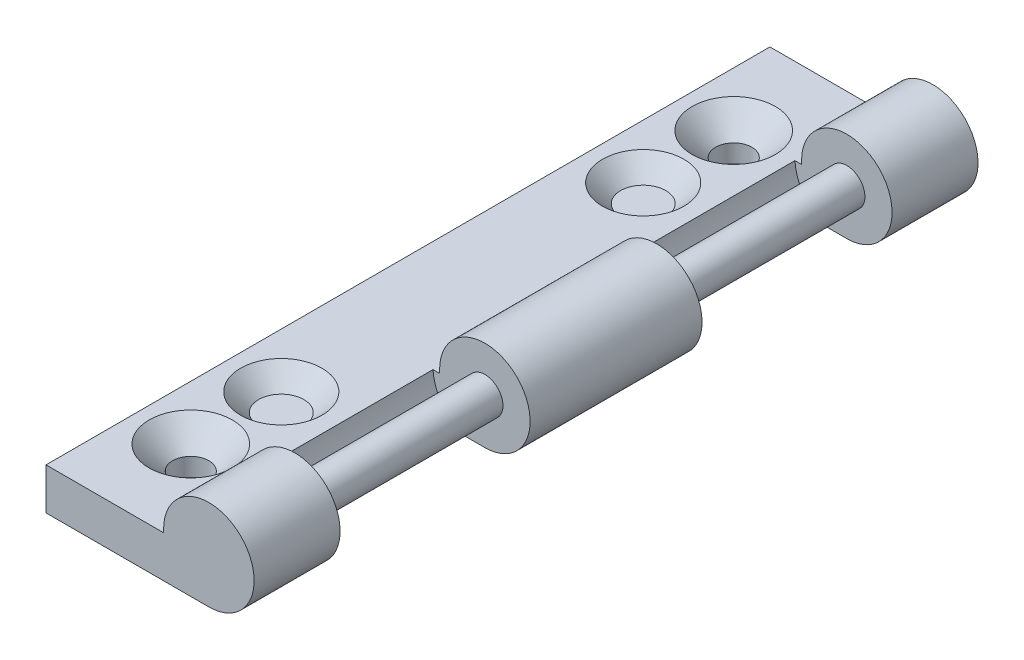
ISO-10303-21;
HEADER;
FILE_DESCRIPTION(('STEP AP214'),'2;1');
FILE_NAME('part.step','',(''),(''),'','','');
FILE_SCHEMA(('AUTOMOTIVE_DESIGN { 1 0 10303 214 1 1 1 1 }'));
ENDSEC;
DATA;
#1=APPLICATION_CONTEXT('core data for automotive mechanical design processes');
#2=APPLICATION_PROTOCOL_DEFINITION('international standard','automotive_design',2000,#1);
#3=PRODUCT_CONTEXT('',#1,'mechanical');
#4=PRODUCT('Part','Part','',(#3));
#5=PRODUCT_RELATED_PRODUCT_CATEGORY('part','',(#4));
#6=PRODUCT_DEFINITION_FORMATION('','',#4);
#7=PRODUCT_DEFINITION_CONTEXT('part definition',#1,'design');
#8=PRODUCT_DEFINITION('design','',#6,#7);
#9=PRODUCT_DEFINITION_SHAPE('','',#8);
#10=(LENGTH_UNIT() NAMED_UNIT(*) SI_UNIT(.MILLI.,.METRE.));
#11=(NAMED_UNIT(*) PLANE_ANGLE_UNIT() SI_UNIT($,.RADIAN.));
#12=(NAMED_UNIT(*) SI_UNIT($,.STERADIAN.) SOLID_ANGLE_UNIT());
#13=UNCERTAINTY_MEASURE_WITH_UNIT(LENGTH_MEASURE(1.E-05),#10,'distance_accuracy_value','');
#14=(GEOMETRIC_REPRESENTATION_CONTEXT(3) GLOBAL_UNCERTAINTY_ASSIGNED_CONTEXT((#13)) GLOBAL_UNIT_ASSIGNED_CONTEXT((#10,
#11,#12)) REPRESENTATION_CONTEXT('',''));
#15=CARTESIAN_POINT('',(0.,0.,0.));
#16=DIRECTION('',(0.,0.,1.));
#17=DIRECTION('',(1.,0.,0.));
#18=AXIS2_PLACEMENT_3D('',#15,#16,#17);
#19=CARTESIAN_POINT('',(0.,0.,0.));
#20=DIRECTION('',(0.,1.,0.));
#21=DIRECTION('',(0.,0.,1.));
#22=AXIS2_PLACEMENT_3D('',#19,#20,#21);
#23=PLANE('',#22);
#24=CARTESIAN_POINT('',(-6.,0.,-35.));
#25=DIRECTION('',(0.,-1.,0.));
#26=DIRECTION('',(0.,0.,-1.));
#27=AXIS2_PLACEMENT_3D('',#24,#25,#26);
#28=CIRCLE('',#27,1.);
#29=CARTESIAN_POINT('',(-6.,0.,-36.));
#30=VERTEX_POINT('',#29);
#31=EDGE_CURVE('E256',#30,#30,#28,.T.);
#32=ORIENTED_EDGE('',*,*,#31,.F.);
#33=EDGE_LOOP('',(#32));
#34=FACE_BOUND('',#33,.T.);
#35=CARTESIAN_POINT('',(-6.,0.,-5.));
#36=DIRECTION('',(0.,1.,0.));
#37=DIRECTION('',(0.,0.,1.));
#38=AXIS2_PLACEMENT_3D('',#35,#36,#37);
#39=CIRCLE('',#38,1.);
#40=CARTESIAN_POINT('',(-6.,0.,-4.));
#41=VERTEX_POINT('',#40);
#42=EDGE_CURVE('E259',#41,#41,#39,.T.);
#43=ORIENTED_EDGE('',*,*,#42,.T.);
#44=EDGE_LOOP('',(#43));
#45=FACE_BOUND('',#44,.T.);
#46=DIRECTION('',(-1.,0.,0.));
#47=VECTOR('',#46,1.);
#48=CARTESIAN_POINT('',(0.,0.,-24.75));
#49=LINE('',#48,#47);
#50=CARTESIAN_POINT('',(0.,0.,-24.75));
#51=VERTEX_POINT('',#50);
#52=CARTESIAN_POINT('',(-1.41972708645007,0.,-24.75));
#53=VERTEX_POINT('',#52);
#54=EDGE_CURVE('E273',#51,#53,#49,.T.);
#55=ORIENTED_EDGE('',*,*,#54,.F.);
#56=DIRECTION('',(0.,0.,-1.));
#57=VECTOR('',#56,1.);
#58=CARTESIAN_POINT('',(0.,0.,-40.));
#59=LINE('',#58,#57);
#60=CARTESIAN_POINT('',(0.,0.,-15.25));
#61=VERTEX_POINT('',#60);
#62=EDGE_CURVE('E300',#61,#51,#59,.T.);
#63=ORIENTED_EDGE('',*,*,#62,.F.);
#64=DIRECTION('',(1.,0.,0.));
#65=VECTOR('',#64,1.);
#66=CARTESIAN_POINT('',(0.,0.,-15.25));
#67=LINE('',#66,#65);
#68=CARTESIAN_POINT('',(-1.41972708645007,0.,-15.25));
#69=VERTEX_POINT('',#68);
#70=EDGE_CURVE('E283',#69,#61,#67,.T.);
#71=ORIENTED_EDGE('',*,*,#70,.F.);
#72=DIRECTION('',(0.,0.,1.));
#73=VECTOR('',#72,1.);
#74=CARTESIAN_POINT('',(-1.41972708645007,0.,-15.25));
#75=LINE('',#74,#73);
#76=CARTESIAN_POINT('',(-1.41972708645007,0.,-4.75));
#77=VERTEX_POINT('',#76);
#78=EDGE_CURVE('E183',#69,#77,#75,.T.);
#79=ORIENTED_EDGE('',*,*,#78,.T.);
#80=DIRECTION('',(1.,0.,0.));
#81=VECTOR('',#80,1.);
#82=CARTESIAN_POINT('',(0.,0.,-4.75));
#83=LINE('',#82,#81);
#84=CARTESIAN_POINT('',(0.,0.,-4.75));
#85=VERTEX_POINT('',#84);
#86=EDGE_CURVE('E279',#77,#85,#83,.T.);
#87=ORIENTED_EDGE('',*,*,#86,.T.);
#88=CARTESIAN_POINT('',(0.,0.,0.));
#89=VERTEX_POINT('',#88);
#90=EDGE_CURVE('E175',#89,#85,#59,.T.);
#91=ORIENTED_EDGE('',*,*,#90,.F.);
#92=DIRECTION('',(1.,0.,0.));
#93=VECTOR('',#92,1.);
#94=CARTESIAN_POINT('',(-9.00000000000002,0.,0.));
#95=LINE('',#94,#93);
#96=CARTESIAN_POINT('',(-9.00000000000002,0.,0.));
#97=VERTEX_POINT('',#96);
#98=EDGE_CURVE('E297',#97,#89,#95,.T.);
#99=ORIENTED_EDGE('',*,*,#98,.F.);
#100=DIRECTION('',(0.,0.,1.));
#101=VECTOR('',#100,1.);
#102=CARTESIAN_POINT('',(-9.,0.,-40.));
#103=LINE('',#102,#101);
#104=CARTESIAN_POINT('',(-9.,0.,-40.));
#105=VERTEX_POINT('',#104);
#106=EDGE_CURVE('E294',#105,#97,#103,.T.);
#107=ORIENTED_EDGE('',*,*,#106,.F.);
#108=DIRECTION('',(-1.,0.,0.));
#109=VECTOR('',#108,1.);
#110=CARTESIAN_POINT('',(-9.,0.,-40.));
#111=LINE('',#110,#109);
#112=CARTESIAN_POINT('',(0.,0.,-40.));
#113=VERTEX_POINT('',#112);
#114=EDGE_CURVE('E170',#113,#105,#111,.T.);
#115=ORIENTED_EDGE('',*,*,#114,.F.);
#116=CARTESIAN_POINT('',(0.,0.,-35.25));
#117=VERTEX_POINT('',#116);
#118=EDGE_CURVE('E298',#117,#113,#59,.T.);
#119=ORIENTED_EDGE('',*,*,#118,.F.);
#120=DIRECTION('',(-1.,0.,0.));
#121=VECTOR('',#120,1.);
#122=CARTESIAN_POINT('',(0.,0.,-35.25));
#123=LINE('',#122,#121);
#124=CARTESIAN_POINT('',(-1.41972708645007,0.,-35.25));
#125=VERTEX_POINT('',#124);
#126=EDGE_CURVE('E59',#117,#125,#123,.T.);
#127=ORIENTED_EDGE('',*,*,#126,.T.);
#128=DIRECTION('',(0.,0.,-1.));
#129=VECTOR('',#128,1.);
#130=CARTESIAN_POINT('',(-1.41972708645007,0.,-24.75));
#131=LINE('',#130,#129);
#132=EDGE_CURVE('E191',#53,#125,#131,.T.);
#133=ORIENTED_EDGE('',*,*,#132,.F.);
#134=EDGE_LOOP('',(#55,#63,#71,#79,#87,#91,#99,#107,#115,#119,#127,#133));
#135=FACE_BOUND('',#134,.T.);
#136=ADVANCED_FACE('F35',(#34,#45,#135),#23,.F.);
#137=CARTESIAN_POINT('',(0.,2.5,-47.0710678118655));
#138=DIRECTION('',(0.,0.,1.));
#139=DIRECTION('',(1.,0.,0.));
#140=AXIS2_PLACEMENT_3D('',#137,#138,#139);
#141=CYLINDRICAL_SURFACE('',#140,2.5);
#142=ORIENTED_EDGE('',*,*,#62,.T.);
#143=CARTESIAN_POINT('',(0.,2.5,-24.75));
#144=DIRECTION('',(0.,0.,-1.));
#145=DIRECTION('',(-1.,0.,0.));
#146=AXIS2_PLACEMENT_3D('',#143,#144,#145);
#147=CIRCLE('',#146,2.5);
#148=CARTESIAN_POINT('',(-2.5,2.5,-24.75));
#149=VERTEX_POINT('',#148);
#150=EDGE_CURVE('E188',#51,#149,#147,.F.);
#151=ORIENTED_EDGE('',*,*,#150,.T.);
#152=DIRECTION('',(0.,0.,1.));
#153=VECTOR('',#152,1.);
#154=CARTESIAN_POINT('',(-2.5,2.5,-47.0710678118655));
#155=LINE('',#154,#153);
#156=CARTESIAN_POINT('',(-2.5,2.5,-15.25));
#157=VERTEX_POINT('',#156);
#158=EDGE_CURVE('E295',#149,#157,#155,.T.);
#159=ORIENTED_EDGE('',*,*,#158,.T.);
#160=CARTESIAN_POINT('',(0.,2.5,-15.25));
#161=DIRECTION('',(0.,0.,1.));
#162=DIRECTION('',(1.,0.,0.));
#163=AXIS2_PLACEMENT_3D('',#160,#161,#162);
#164=CIRCLE('',#163,2.5);
#165=EDGE_CURVE('E180',#157,#61,#164,.F.);
#166=ORIENTED_EDGE('',*,*,#165,.T.);
#167=EDGE_LOOP('',(#142,#151,#159,#166));
#168=FACE_BOUND('',#167,.T.);
#169=ADVANCED_FACE('F334',(#168),#141,.T.);
#170=CARTESIAN_POINT('',(0.,2.5,-35.25));
#171=DIRECTION('',(0.,0.,-1.));
#172=DIRECTION('',(-1.,0.,0.));
#173=AXIS2_PLACEMENT_3D('',#170,#171,#172);
#174=CIRCLE('',#173,2.5);
#175=CARTESIAN_POINT('',(-2.5,2.5,-35.25));
#176=VERTEX_POINT('',#175);
#177=EDGE_CURVE('E186',#117,#176,#174,.F.);
#178=ORIENTED_EDGE('',*,*,#177,.F.);
#179=ORIENTED_EDGE('',*,*,#118,.T.);
#180=CARTESIAN_POINT('',(0.,2.5,-40.));
#181=DIRECTION('',(0.,0.,1.));
#182=DIRECTION('',(1.,0.,0.));
#183=AXIS2_PLACEMENT_3D('',#180,#181,#182);
#184=CIRCLE('',#183,2.5);
#185=CARTESIAN_POINT('',(-2.5,2.5,-40.));
#186=VERTEX_POINT('',#185);
#187=EDGE_CURVE('E288',#186,#113,#184,.F.);
#188=ORIENTED_EDGE('',*,*,#187,.F.);
#189=EDGE_CURVE('E291',#186,#176,#155,.T.);
#190=ORIENTED_EDGE('',*,*,#189,.T.);
#191=EDGE_LOOP('',(#178,#179,#188,#190));
#192=FACE_BOUND('',#191,.T.);
#193=ADVANCED_FACE('F309',(#192),#141,.T.);
#194=CARTESIAN_POINT('',(-9.,2.5,-40.));
#195=DIRECTION('',(1.,0.,0.));
#196=DIRECTION('',(0.,0.,-1.));
#197=AXIS2_PLACEMENT_3D('',#194,#195,#196);
#198=PLANE('',#197);
#199=DIRECTION('',(0.,-1.,0.));
#200=VECTOR('',#199,1.);
#201=CARTESIAN_POINT('',(-9.00000000000002,2.5,0.));
#202=LINE('',#201,#200);
#203=CARTESIAN_POINT('',(-9.00000000000002,2.3,0.));
#204=VERTEX_POINT('',#203);
#205=EDGE_CURVE('E164',#204,#97,#202,.T.);
#206=ORIENTED_EDGE('',*,*,#205,.F.);
#207=DIRECTION('',(0.,0.,1.));
#208=VECTOR('',#207,1.);
#209=CARTESIAN_POINT('',(-9.00000000000002,2.3,-40.));
#210=LINE('',#209,#208);
#211=CARTESIAN_POINT('',(-9.00000000000002,2.3,-40.));
#212=VERTEX_POINT('',#211);
#213=EDGE_CURVE('E147',#212,#204,#210,.T.);
#214=ORIENTED_EDGE('',*,*,#213,.F.);
#215=DIRECTION('',(0.,-1.,0.));
#216=VECTOR('',#215,1.);
#217=CARTESIAN_POINT('',(-9.,2.5,-40.));
#218=LINE('',#217,#216);
#219=EDGE_CURVE('E162',#212,#105,#218,.T.);
#220=ORIENTED_EDGE('',*,*,#219,.T.);
#221=ORIENTED_EDGE('',*,*,#106,.T.);
#222=EDGE_LOOP('',(#206,#214,#220,#221));
#223=FACE_BOUND('',#222,.T.);
#224=ADVANCED_FACE('F160',(#223),#198,.F.);
#225=CARTESIAN_POINT('',(-9.00000000000002,2.5,0.));
#226=DIRECTION('',(0.,0.,-1.));
#227=DIRECTION('',(-1.,0.,0.));
#228=AXIS2_PLACEMENT_3D('',#225,#226,#227);
#229=PLANE('',#228);
#230=CARTESIAN_POINT('',(0.,2.5,0.));
#231=DIRECTION('',(0.,0.,1.));
#232=DIRECTION('',(1.,0.,0.));
#233=AXIS2_PLACEMENT_3D('',#230,#231,#232);
#234=CIRCLE('',#233,2.5);
#235=CARTESIAN_POINT('',(-2.5,2.5,0.));
#236=VERTEX_POINT('',#235);
#237=EDGE_CURVE('E285',#89,#236,#234,.T.);
#238=ORIENTED_EDGE('',*,*,#237,.T.);
#239=DIRECTION('',(0.,1.,0.));
#240=VECTOR('',#239,1.);
#241=CARTESIAN_POINT('',(-2.5,2.5,0.));
#242=LINE('',#241,#240);
#243=CARTESIAN_POINT('',(-2.5,2.3,0.));
#244=VERTEX_POINT('',#243);
#245=EDGE_CURVE('E156',#244,#236,#242,.T.);
#246=ORIENTED_EDGE('',*,*,#245,.F.);
#247=DIRECTION('',(1.,0.,0.));
#248=VECTOR('',#247,1.);
#249=CARTESIAN_POINT('',(-9.00000000000002,2.3,0.));
#250=LINE('',#249,#248);
#251=EDGE_CURVE('E223',#204,#244,#250,.T.);
#252=ORIENTED_EDGE('',*,*,#251,.F.);
#253=ORIENTED_EDGE('',*,*,#205,.T.);
#254=ORIENTED_EDGE('',*,*,#98,.T.);
#255=EDGE_LOOP('',(#238,#246,#252,#253,#254));
#256=FACE_BOUND('',#255,.T.);
#257=ADVANCED_FACE('F349',(#256),#229,.F.);
#258=CARTESIAN_POINT('',(-9.,2.5,-40.));
#259=DIRECTION('',(0.,0.,1.));
#260=DIRECTION('',(1.,0.,0.));
#261=AXIS2_PLACEMENT_3D('',#258,#259,#260);
#262=PLANE('',#261);
#263=DIRECTION('',(1.,0.,0.));
#264=VECTOR('',#263,1.);
#265=CARTESIAN_POINT('',(-9.00000000000002,2.3,-40.));
#266=LINE('',#265,#264);
#267=CARTESIAN_POINT('',(-2.5,2.3,-40.));
#268=VERTEX_POINT('',#267);
#269=EDGE_CURVE('E142',#212,#268,#266,.T.);
#270=ORIENTED_EDGE('',*,*,#269,.T.);
#271=DIRECTION('',(0.,1.,0.));
#272=VECTOR('',#271,1.);
#273=CARTESIAN_POINT('',(-2.5,2.5,-40.));
#274=LINE('',#273,#272);
#275=EDGE_CURVE('E155',#268,#186,#274,.T.);
#276=ORIENTED_EDGE('',*,*,#275,.T.);
#277=ORIENTED_EDGE('',*,*,#187,.T.);
#278=ORIENTED_EDGE('',*,*,#114,.T.);
#279=ORIENTED_EDGE('',*,*,#219,.F.);
#280=EDGE_LOOP('',(#270,#276,#277,#278,#279));
#281=FACE_BOUND('',#280,.T.);
#282=ADVANCED_FACE('F167',(#281),#262,.F.);
#283=CARTESIAN_POINT('',(0.,2.5,-4.75));
#284=DIRECTION('',(0.,0.,1.));
#285=DIRECTION('',(1.,0.,0.));
#286=AXIS2_PLACEMENT_3D('',#283,#284,#285);
#287=CIRCLE('',#286,2.5);
#288=CARTESIAN_POINT('',(-2.5,2.5,-4.75));
#289=VERTEX_POINT('',#288);
#290=EDGE_CURVE('E173',#289,#85,#287,.F.);
#291=ORIENTED_EDGE('',*,*,#290,.F.);
#292=EDGE_CURVE('E290',#289,#236,#155,.T.);
#293=ORIENTED_EDGE('',*,*,#292,.T.);
#294=ORIENTED_EDGE('',*,*,#237,.F.);
#295=ORIENTED_EDGE('',*,*,#90,.T.);
#296=EDGE_LOOP('',(#291,#293,#294,#295));
#297=FACE_BOUND('',#296,.T.);
#298=ADVANCED_FACE('F342',(#297),#141,.T.);
#299=CARTESIAN_POINT('',(0.,2.5,-15.25));
#300=DIRECTION('',(0.,0.,1.));
#301=DIRECTION('',(1.,0.,0.));
#302=AXIS2_PLACEMENT_3D('',#299,#300,#301);
#303=CYLINDRICAL_SURFACE('',#302,2.875);
#304=CARTESIAN_POINT('',(0.,2.5,-15.25));
#305=DIRECTION('',(0.,0.,1.));
#306=DIRECTION('',(1.,0.,0.));
#307=AXIS2_PLACEMENT_3D('',#304,#305,#306);
#308=CIRCLE('',#307,2.875);
#309=CARTESIAN_POINT('',(-2.86803504162693,2.3,-15.25));
#310=VERTEX_POINT('',#309);
#311=EDGE_CURVE('E277',#310,#69,#308,.T.);
#312=ORIENTED_EDGE('',*,*,#311,.F.);
#313=DIRECTION('',(0.,0.,1.));
#314=VECTOR('',#313,1.);
#315=CARTESIAN_POINT('',(-2.86803504162693,2.3,-15.25));
#316=LINE('',#315,#314);
#317=CARTESIAN_POINT('',(-2.86803504162693,2.3,-4.75));
#318=VERTEX_POINT('',#317);
#319=EDGE_CURVE('E244',#310,#318,#316,.T.);
#320=ORIENTED_EDGE('',*,*,#319,.T.);
#321=CARTESIAN_POINT('',(0.,2.5,-4.75));
#322=DIRECTION('',(0.,0.,1.));
#323=DIRECTION('',(1.,0.,0.));
#324=AXIS2_PLACEMENT_3D('',#321,#322,#323);
#325=CIRCLE('',#324,2.875);
#326=EDGE_CURVE('E276',#318,#77,#325,.T.);
#327=ORIENTED_EDGE('',*,*,#326,.T.);
#328=ORIENTED_EDGE('',*,*,#78,.F.);
#329=EDGE_LOOP('',(#312,#320,#327,#328));
#330=FACE_BOUND('',#329,.T.);
#331=ADVANCED_FACE('F534',(#330),#303,.F.);
#332=CARTESIAN_POINT('',(0.,2.5,-15.25));
#333=DIRECTION('',(0.,0.,1.));
#334=DIRECTION('',(1.,0.,0.));
#335=AXIS2_PLACEMENT_3D('',#332,#333,#334);
#336=PLANE('',#335);
#337=DIRECTION('',(0.,1.,0.));
#338=VECTOR('',#337,1.);
#339=CARTESIAN_POINT('',(-2.5,2.5,-15.25));
#340=LINE('',#339,#338);
#341=CARTESIAN_POINT('',(-2.5,2.3,-15.25));
#342=VERTEX_POINT('',#341);
#343=EDGE_CURVE('E254',#342,#157,#340,.T.);
#344=ORIENTED_EDGE('',*,*,#343,.F.);
#345=DIRECTION('',(1.,0.,0.));
#346=VECTOR('',#345,1.);
#347=CARTESIAN_POINT('',(0.,2.3,-15.25));
#348=LINE('',#347,#346);
#349=EDGE_CURVE('E247',#310,#342,#348,.T.);
#350=ORIENTED_EDGE('',*,*,#349,.F.);
#351=ORIENTED_EDGE('',*,*,#311,.T.);
#352=ORIENTED_EDGE('',*,*,#70,.T.);
#353=ORIENTED_EDGE('',*,*,#165,.F.);
#354=EDGE_LOOP('',(#344,#350,#351,#352,#353));
#355=FACE_BOUND('',#354,.T.);
#356=CARTESIAN_POINT('',(0.,2.5,-15.25));
#357=DIRECTION('',(0.,0.,1.));
#358=DIRECTION('',(1.,0.,0.));
#359=AXIS2_PLACEMENT_3D('',#356,#357,#358);
#360=CIRCLE('',#359,1.);
#361=CARTESIAN_POINT('',(1.,2.5,-15.25));
#362=VERTEX_POINT('',#361);
#363=EDGE_CURVE('E265',#362,#362,#360,.T.);
#364=ORIENTED_EDGE('',*,*,#363,.F.);
#365=EDGE_LOOP('',(#364));
#366=FACE_BOUND('',#365,.T.);
#367=ADVANCED_FACE('F525',(#355,#366),#336,.T.);
#368=CARTESIAN_POINT('',(0.,2.5,-4.75));
#369=DIRECTION('',(0.,0.,1.));
#370=DIRECTION('',(1.,0.,0.));
#371=AXIS2_PLACEMENT_3D('',#368,#369,#370);
#372=PLANE('',#371);
#373=CARTESIAN_POINT('',(0.,2.5,-4.75));
#374=DIRECTION('',(0.,0.,1.));
#375=DIRECTION('',(1.,0.,0.));
#376=AXIS2_PLACEMENT_3D('',#373,#374,#375);
#377=CIRCLE('',#376,1.);
#378=CARTESIAN_POINT('',(1.,2.5,-4.75));
#379=VERTEX_POINT('',#378);
#380=EDGE_CURVE('E194',#379,#379,#377,.F.);
#381=ORIENTED_EDGE('',*,*,#380,.F.);
#382=EDGE_LOOP('',(#381));
#383=FACE_BOUND('',#382,.T.);
#384=DIRECTION('',(1.,0.,0.));
#385=VECTOR('',#384,1.);
#386=CARTESIAN_POINT('',(0.,2.3,-4.75));
#387=LINE('',#386,#385);
#388=CARTESIAN_POINT('',(-2.5,2.3,-4.75));
#389=VERTEX_POINT('',#388);
#390=EDGE_CURVE('E241',#318,#389,#387,.T.);
#391=ORIENTED_EDGE('',*,*,#390,.T.);
#392=DIRECTION('',(0.,1.,0.));
#393=VECTOR('',#392,1.);
#394=CARTESIAN_POINT('',(-2.5,2.5,-4.75));
#395=LINE('',#394,#393);
#396=EDGE_CURVE('E251',#389,#289,#395,.T.);
#397=ORIENTED_EDGE('',*,*,#396,.T.);
#398=ORIENTED_EDGE('',*,*,#290,.T.);
#399=ORIENTED_EDGE('',*,*,#86,.F.);
#400=ORIENTED_EDGE('',*,*,#326,.F.);
#401=EDGE_LOOP('',(#391,#397,#398,#399,#400));
#402=FACE_BOUND('',#401,.T.);
#403=ADVANCED_FACE('F508',(#383,#402),#372,.F.);
#404=CARTESIAN_POINT('',(0.,2.5,-24.75));
#405=DIRECTION('',(0.,0.,-1.));
#406=DIRECTION('',(-1.,0.,0.));
#407=AXIS2_PLACEMENT_3D('',#404,#405,#406);
#408=CYLINDRICAL_SURFACE('',#407,2.875);
#409=DIRECTION('',(0.,0.,-1.));
#410=VECTOR('',#409,1.);
#411=CARTESIAN_POINT('',(-2.86803504162693,2.3,-24.75));
#412=LINE('',#411,#410);
#413=CARTESIAN_POINT('',(-2.86803504162693,2.3,-24.75));
#414=VERTEX_POINT('',#413);
#415=CARTESIAN_POINT('',(-2.86803504162693,2.3,-35.25));
#416=VERTEX_POINT('',#415);
#417=EDGE_CURVE('E51',#414,#416,#412,.T.);
#418=ORIENTED_EDGE('',*,*,#417,.F.);
#419=CARTESIAN_POINT('',(0.,2.5,-24.75));
#420=DIRECTION('',(0.,0.,1.));
#421=DIRECTION('',(1.,0.,0.));
#422=AXIS2_PLACEMENT_3D('',#419,#420,#421);
#423=CIRCLE('',#422,2.875);
#424=EDGE_CURVE('E269',#414,#53,#423,.T.);
#425=ORIENTED_EDGE('',*,*,#424,.T.);
#426=ORIENTED_EDGE('',*,*,#132,.T.);
#427=CARTESIAN_POINT('',(0.,2.5,-35.25));
#428=DIRECTION('',(0.,0.,1.));
#429=DIRECTION('',(1.,0.,0.));
#430=AXIS2_PLACEMENT_3D('',#427,#428,#429);
#431=CIRCLE('',#430,2.875);
#432=EDGE_CURVE('E268',#416,#125,#431,.T.);
#433=ORIENTED_EDGE('',*,*,#432,.F.);
#434=EDGE_LOOP('',(#418,#425,#426,#433));
#435=FACE_BOUND('',#434,.T.);
#436=ADVANCED_FACE('F328',(#435),#408,.F.);
#437=CARTESIAN_POINT('',(0.,2.5,-24.75));
#438=DIRECTION('',(0.,0.,-1.));
#439=DIRECTION('',(1.,0.,0.));
#440=AXIS2_PLACEMENT_3D('',#437,#438,#439);
#441=PLANE('',#440);
#442=DIRECTION('',(0.,-1.,0.));
#443=VECTOR('',#442,1.);
#444=CARTESIAN_POINT('',(-2.5,2.5,-24.75));
#445=LINE('',#444,#443);
#446=CARTESIAN_POINT('',(-2.5,2.3,-24.75));
#447=VERTEX_POINT('',#446);
#448=EDGE_CURVE('E249',#149,#447,#445,.T.);
#449=ORIENTED_EDGE('',*,*,#448,.F.);
#450=ORIENTED_EDGE('',*,*,#150,.F.);
#451=ORIENTED_EDGE('',*,*,#54,.T.);
#452=ORIENTED_EDGE('',*,*,#424,.F.);
#453=DIRECTION('',(-1.,0.,0.));
#454=VECTOR('',#453,1.);
#455=CARTESIAN_POINT('',(0.,2.3,-24.75));
#456=LINE('',#455,#454);
#457=EDGE_CURVE('E239',#447,#414,#456,.T.);
#458=ORIENTED_EDGE('',*,*,#457,.F.);
#459=EDGE_LOOP('',(#449,#450,#451,#452,#458));
#460=FACE_BOUND('',#459,.T.);
#461=CARTESIAN_POINT('',(0.,2.5,-24.75));
#462=DIRECTION('',(0.,0.,-1.));
#463=DIRECTION('',(-1.,0.,0.));
#464=AXIS2_PLACEMENT_3D('',#461,#462,#463);
#465=CIRCLE('',#464,1.);
#466=CARTESIAN_POINT('',(1.,2.5,-24.75));
#467=VERTEX_POINT('',#466);
#468=EDGE_CURVE('E197',#467,#467,#465,.T.);
#469=ORIENTED_EDGE('',*,*,#468,.F.);
#470=EDGE_LOOP('',(#469));
#471=FACE_BOUND('',#470,.T.);
#472=ADVANCED_FACE('F318',(#460,#471),#441,.T.);
#473=CARTESIAN_POINT('',(0.,2.5,-35.25));
#474=DIRECTION('',(0.,0.,-1.));
#475=DIRECTION('',(1.,0.,0.));
#476=AXIS2_PLACEMENT_3D('',#473,#474,#475);
#477=PLANE('',#476);
#478=CARTESIAN_POINT('',(0.,2.5,-35.25));
#479=DIRECTION('',(0.,0.,-1.));
#480=DIRECTION('',(-1.,0.,0.));
#481=AXIS2_PLACEMENT_3D('',#478,#479,#480);
#482=CIRCLE('',#481,1.);
#483=CARTESIAN_POINT('',(1.,2.5,-35.25));
#484=VERTEX_POINT('',#483);
#485=EDGE_CURVE('E262',#484,#484,#482,.F.);
#486=ORIENTED_EDGE('',*,*,#485,.F.);
#487=EDGE_LOOP('',(#486));
#488=FACE_BOUND('',#487,.T.);
#489=ORIENTED_EDGE('',*,*,#177,.T.);
#490=DIRECTION('',(0.,-1.,0.));
#491=VECTOR('',#490,1.);
#492=CARTESIAN_POINT('',(-2.5,2.5,-35.25));
#493=LINE('',#492,#491);
#494=CARTESIAN_POINT('',(-2.5,2.3,-35.25));
#495=VERTEX_POINT('',#494);
#496=EDGE_CURVE('E206',#176,#495,#493,.T.);
#497=ORIENTED_EDGE('',*,*,#496,.T.);
#498=DIRECTION('',(-1.,0.,0.));
#499=VECTOR('',#498,1.);
#500=CARTESIAN_POINT('',(0.,2.3,-35.25));
#501=LINE('',#500,#499);
#502=EDGE_CURVE('E236',#495,#416,#501,.T.);
#503=ORIENTED_EDGE('',*,*,#502,.T.);
#504=ORIENTED_EDGE('',*,*,#432,.T.);
#505=ORIENTED_EDGE('',*,*,#126,.F.);
#506=EDGE_LOOP('',(#489,#497,#503,#504,#505));
#507=FACE_BOUND('',#506,.T.);
#508=ADVANCED_FACE('F315',(#488,#507),#477,.F.);
#509=CARTESIAN_POINT('',(0.,2.5,0.00200000000000027));
#510=DIRECTION('',(0.,0.,-1.));
#511=DIRECTION('',(-1.,0.,0.));
#512=AXIS2_PLACEMENT_3D('',#509,#510,#511);
#513=CYLINDRICAL_SURFACE('',#512,1.);
#514=ORIENTED_EDGE('',*,*,#363,.T.);
#515=EDGE_LOOP('',(#514));
#516=FACE_BOUND('',#515,.T.);
#517=ORIENTED_EDGE('',*,*,#380,.T.);
#518=EDGE_LOOP('',(#517));
#519=FACE_BOUND('',#518,.T.);
#520=ADVANCED_FACE('F317',(#516,#519),#513,.T.);
#521=CARTESIAN_POINT('',(0.,2.5,-40.002));
#522=DIRECTION('',(0.,0.,1.));
#523=DIRECTION('',(1.,0.,0.));
#524=AXIS2_PLACEMENT_3D('',#521,#522,#523);
#525=CYLINDRICAL_SURFACE('',#524,1.);
#526=CARTESIAN_POINT('',(1.,2.5,-24.75));
#527=CARTESIAN_POINT('',(1.,2.5,-24.859375));
#528=CARTESIAN_POINT('',(1.,2.5,-24.96875));
#529=CARTESIAN_POINT('',(1.,2.5,-25.1875));
#530=CARTESIAN_POINT('',(1.,2.5,-25.296875));
#531=CARTESIAN_POINT('',(1.,2.5,-25.515625));
#532=CARTESIAN_POINT('',(1.,2.5,-25.625));
#533=CARTESIAN_POINT('',(1.,2.5,-25.84375));
#534=CARTESIAN_POINT('',(1.,2.5,-25.953125));
#535=CARTESIAN_POINT('',(1.,2.5,-26.171875));
#536=CARTESIAN_POINT('',(1.,2.5,-26.28125));
#537=CARTESIAN_POINT('',(1.,2.5,-26.5));
#538=CARTESIAN_POINT('',(1.,2.5,-26.609375));
#539=CARTESIAN_POINT('',(1.,2.5,-26.828125));
#540=CARTESIAN_POINT('',(1.,2.5,-26.9375));
#541=CARTESIAN_POINT('',(1.,2.5,-27.15625));
#542=CARTESIAN_POINT('',(1.,2.5,-27.265625));
#543=CARTESIAN_POINT('',(1.,2.5,-27.484375));
#544=CARTESIAN_POINT('',(1.,2.5,-27.59375));
#545=CARTESIAN_POINT('',(1.,2.5,-27.8125));
#546=CARTESIAN_POINT('',(1.,2.5,-27.921875));
#547=CARTESIAN_POINT('',(1.,2.5,-28.140625));
#548=CARTESIAN_POINT('',(1.,2.5,-28.25));
#549=CARTESIAN_POINT('',(1.,2.5,-28.46875));
#550=CARTESIAN_POINT('',(1.,2.5,-28.578125));
#551=CARTESIAN_POINT('',(1.,2.5,-28.796875));
#552=CARTESIAN_POINT('',(1.,2.5,-28.90625));
#553=CARTESIAN_POINT('',(1.,2.5,-29.125));
#554=CARTESIAN_POINT('',(1.,2.5,-29.234375));
#555=CARTESIAN_POINT('',(1.,2.5,-29.453125));
#556=CARTESIAN_POINT('',(1.,2.5,-29.5625));
#557=CARTESIAN_POINT('',(1.,2.5,-29.78125));
#558=CARTESIAN_POINT('',(1.,2.5,-29.890625));
#559=CARTESIAN_POINT('',(1.,2.5,-30.109375));
#560=CARTESIAN_POINT('',(1.,2.5,-30.21875));
#561=CARTESIAN_POINT('',(1.,2.5,-30.4375));
#562=CARTESIAN_POINT('',(1.,2.5,-30.546875));
#563=CARTESIAN_POINT('',(1.,2.5,-30.765625));
#564=CARTESIAN_POINT('',(1.,2.5,-30.875));
#565=CARTESIAN_POINT('',(1.,2.5,-31.09375));
#566=CARTESIAN_POINT('',(1.,2.5,-31.203125));
#567=CARTESIAN_POINT('',(1.,2.5,-31.421875));
#568=CARTESIAN_POINT('',(1.,2.5,-31.53125));
#569=CARTESIAN_POINT('',(1.,2.5,-31.75));
#570=CARTESIAN_POINT('',(1.,2.5,-31.859375));
#571=CARTESIAN_POINT('',(1.,2.5,-32.078125));
#572=CARTESIAN_POINT('',(1.,2.5,-32.1875));
#573=CARTESIAN_POINT('',(1.,2.5,-32.40625));
#574=CARTESIAN_POINT('',(1.,2.5,-32.515625));
#575=CARTESIAN_POINT('',(1.,2.5,-32.734375));
#576=CARTESIAN_POINT('',(1.,2.5,-32.84375));
#577=CARTESIAN_POINT('',(1.,2.5,-33.0625));
#578=CARTESIAN_POINT('',(1.,2.5,-33.171875));
#579=CARTESIAN_POINT('',(1.,2.5,-33.390625));
#580=CARTESIAN_POINT('',(1.,2.5,-33.5));
#581=CARTESIAN_POINT('',(1.,2.5,-33.71875));
#582=CARTESIAN_POINT('',(1.,2.5,-33.828125));
#583=CARTESIAN_POINT('',(1.,2.5,-34.046875));
#584=CARTESIAN_POINT('',(1.,2.5,-34.15625));
#585=CARTESIAN_POINT('',(1.,2.5,-34.375));
#586=CARTESIAN_POINT('',(1.,2.5,-34.484375));
#587=CARTESIAN_POINT('',(1.,2.5,-34.703125));
#588=CARTESIAN_POINT('',(1.,2.5,-34.8125));
#589=CARTESIAN_POINT('',(1.,2.5,-35.03125));
#590=CARTESIAN_POINT('',(1.,2.5,-35.140625));
#591=CARTESIAN_POINT('',(1.,2.5,-35.25));
#592=B_SPLINE_CURVE_WITH_KNOTS('',3,(#526,#527,#528,#529,#530,#531,#532,#533,#534,#535,#536,
#537,#538,#539,#540,#541,#542,#543,#544,#545,#546,#547,#548,#549,#550,#551,#552,#553,#554,#555,
#556,#557,#558,#559,#560,#561,#562,#563,#564,#565,#566,#567,#568,#569,#570,#571,#572,#573,#574,
#575,#576,#577,#578,#579,#580,#581,#582,#583,#584,#585,#586,#587,#588,#589,#590,#591),
.UNSPECIFIED.,.F.,.F.,(4,2,2,2,2,2,2,2,2,2,2,2,2,2,2,2,2,2,2,2,2,2,2,2,2,2,2,2,2,2,2,2,4),(0.,
0.328124999999999,0.656249999999997,0.984374999999996,1.3125,1.640625,1.96875,2.296875,2.625,
2.953125,3.28125,3.609375,3.9375,4.265625,4.59375,4.921875,5.25,5.578125,5.90625,6.234375,
6.5625,6.890625,7.21875,7.546875,7.875,8.203125,8.53125,8.859375,9.1875,9.515625,9.84375,
10.171875,10.5),.UNSPECIFIED.);
#593=EDGE_CURVE('BSEAM325',#467,#484,#592,.T.);
#594=ORIENTED_EDGE('',*,*,#468,.T.);
#595=ORIENTED_EDGE('',*,*,#485,.T.);
#596=ORIENTED_EDGE('',*,*,#593,.T.);
#597=ORIENTED_EDGE('',*,*,#593,.F.);
#598=EDGE_LOOP('',(#594,#596,#595,#597));
#599=FACE_BOUND('',#598,.T.);
#600=ADVANCED_FACE('F325',(#599),#525,.T.);
#601=CARTESIAN_POINT('',(-6.,0.,-5.));
#602=DIRECTION('',(0.,1.,0.));
#603=DIRECTION('',(0.,0.,1.));
#604=AXIS2_PLACEMENT_3D('',#601,#602,#603);
#605=CYLINDRICAL_SURFACE('',#604,1.);
#606=CARTESIAN_POINT('',(-6.,1.,-5.));
#607=DIRECTION('',(0.,1.,0.));
#608=DIRECTION('',(0.,0.,1.));
#609=AXIS2_PLACEMENT_3D('',#606,#607,#608);
#610=CIRCLE('',#609,1.);
#611=CARTESIAN_POINT('',(-6.,1.,-4.));
#612=VERTEX_POINT('',#611);
#613=EDGE_CURVE('E200',#612,#612,#610,.T.);
#614=ORIENTED_EDGE('',*,*,#613,.T.);
#615=EDGE_LOOP('',(#614));
#616=FACE_BOUND('',#615,.T.);
#617=ORIENTED_EDGE('',*,*,#42,.F.);
#618=EDGE_LOOP('',(#617));
#619=FACE_BOUND('',#618,.T.);
#620=ADVANCED_FACE('F400',(#616,#619),#605,.F.);
#621=CARTESIAN_POINT('',(-6.,0.,-35.));
#622=DIRECTION('',(0.,1.,0.));
#623=DIRECTION('',(0.,0.,1.));
#624=AXIS2_PLACEMENT_3D('',#621,#622,#623);
#625=CYLINDRICAL_SURFACE('',#624,1.);
#626=CARTESIAN_POINT('',(-6.,0.99999999999999,-35.));
#627=DIRECTION('',(0.,1.,0.));
#628=DIRECTION('',(0.,0.,1.));
#629=AXIS2_PLACEMENT_3D('',#626,#627,#628);
#630=CIRCLE('',#629,1.);
#631=CARTESIAN_POINT('',(-6.,0.99999999999999,-34.));
#632=VERTEX_POINT('',#631);
#633=EDGE_CURVE('E203',#632,#632,#630,.T.);
#634=ORIENTED_EDGE('',*,*,#633,.T.);
#635=EDGE_LOOP('',(#634));
#636=FACE_BOUND('',#635,.T.);
#637=ORIENTED_EDGE('',*,*,#31,.T.);
#638=EDGE_LOOP('',(#637));
#639=FACE_BOUND('',#638,.T.);
#640=ADVANCED_FACE('F363',(#636,#639),#625,.F.);
#641=CARTESIAN_POINT('',(-6.,1.,-5.));
#642=DIRECTION('',(0.,1.,0.));
#643=DIRECTION('',(0.,0.,1.));
#644=AXIS2_PLACEMENT_3D('',#641,#642,#643);
#645=CONICAL_SURFACE('',#644,1.,0.785398163397451);
#646=CARTESIAN_POINT('',(-6.,2.3,-5.));
#647=DIRECTION('',(0.,-1.,0.));
#648=DIRECTION('',(0.,0.,-1.));
#649=AXIS2_PLACEMENT_3D('',#646,#647,#648);
#650=CIRCLE('',#649,2.3);
#651=CARTESIAN_POINT('',(-6.,2.3,-7.3));
#652=VERTEX_POINT('',#651);
#653=EDGE_CURVE('E210',#652,#652,#650,.T.);
#654=ORIENTED_EDGE('',*,*,#653,.F.);
#655=EDGE_LOOP('',(#654));
#656=FACE_BOUND('',#655,.T.);
#657=ORIENTED_EDGE('',*,*,#613,.F.);
#658=EDGE_LOOP('',(#657));
#659=FACE_BOUND('',#658,.T.);
#660=ADVANCED_FACE('F356',(#656,#659),#645,.F.);
#661=CARTESIAN_POINT('',(-6.,2.5,-35.));
#662=DIRECTION('',(0.,1.,0.));
#663=DIRECTION('',(0.,0.,1.));
#664=AXIS2_PLACEMENT_3D('',#661,#662,#663);
#665=CONICAL_SURFACE('',#664,2.5,0.785398163397443);
#666=CARTESIAN_POINT('',(-6.,2.3,-35.));
#667=DIRECTION('',(0.,-1.,0.));
#668=DIRECTION('',(0.,0.,-1.));
#669=AXIS2_PLACEMENT_3D('',#666,#667,#668);
#670=CIRCLE('',#669,2.3);
#671=CARTESIAN_POINT('',(-6.,2.3,-37.3));
#672=VERTEX_POINT('',#671);
#673=EDGE_CURVE('E207',#672,#672,#670,.T.);
#674=ORIENTED_EDGE('',*,*,#673,.F.);
#675=EDGE_LOOP('',(#674));
#676=FACE_BOUND('',#675,.T.);
#677=ORIENTED_EDGE('',*,*,#633,.F.);
#678=EDGE_LOOP('',(#677));
#679=FACE_BOUND('',#678,.T.);
#680=ADVANCED_FACE('F362',(#676,#679),#665,.F.);
#681=CARTESIAN_POINT('',(-2.5,2.5,-40.));
#682=DIRECTION('',(1.,0.,0.));
#683=DIRECTION('',(0.,0.,-1.));
#684=AXIS2_PLACEMENT_3D('',#681,#682,#683);
#685=PLANE('',#684);
#686=DIRECTION('',(0.,0.,1.));
#687=VECTOR('',#686,1.);
#688=CARTESIAN_POINT('',(-2.5,2.3,-40.));
#689=LINE('',#688,#687);
#690=EDGE_CURVE('E165',#389,#244,#689,.T.);
#691=ORIENTED_EDGE('',*,*,#690,.T.);
#692=ORIENTED_EDGE('',*,*,#245,.T.);
#693=ORIENTED_EDGE('',*,*,#292,.F.);
#694=ORIENTED_EDGE('',*,*,#396,.F.);
#695=EDGE_LOOP('',(#691,#692,#693,#694));
#696=FACE_BOUND('',#695,.T.);
#697=ADVANCED_FACE('F369',(#696),#685,.F.);
#698=ORIENTED_EDGE('',*,*,#189,.F.);
#699=ORIENTED_EDGE('',*,*,#275,.F.);
#700=EDGE_CURVE('E150',#268,#495,#689,.T.);
#701=ORIENTED_EDGE('',*,*,#700,.T.);
#702=ORIENTED_EDGE('',*,*,#496,.F.);
#703=EDGE_LOOP('',(#698,#699,#701,#702));
#704=FACE_BOUND('',#703,.T.);
#705=ADVANCED_FACE('F314',(#704),#685,.F.);
#706=ORIENTED_EDGE('',*,*,#343,.T.);
#707=ORIENTED_EDGE('',*,*,#158,.F.);
#708=ORIENTED_EDGE('',*,*,#448,.T.);
#709=EDGE_CURVE('E232',#447,#342,#689,.T.);
#710=ORIENTED_EDGE('',*,*,#709,.T.);
#711=EDGE_LOOP('',(#706,#707,#708,#710));
#712=FACE_BOUND('',#711,.T.);
#713=ADVANCED_FACE('F391',(#712),#685,.F.);
#714=CARTESIAN_POINT('',(-9.00000000000002,2.3,-40.));
#715=DIRECTION('',(0.,-1.,0.));
#716=DIRECTION('',(0.,0.,-1.));
#717=AXIS2_PLACEMENT_3D('',#714,#715,#716);
#718=PLANE('',#717);
#719=CARTESIAN_POINT('',(-6.,2.3,-10.));
#720=DIRECTION('',(0.,-1.,0.));
#721=DIRECTION('',(0.,0.,-1.));
#722=AXIS2_PLACEMENT_3D('',#719,#720,#721);
#723=CIRCLE('',#722,2.25000000000002);
#724=CARTESIAN_POINT('',(-6.,2.3,-12.25));
#725=VERTEX_POINT('',#724);
#726=EDGE_CURVE('E11',#725,#725,#723,.T.);
#727=ORIENTED_EDGE('',*,*,#726,.T.);
#728=EDGE_LOOP('',(#727));
#729=FACE_BOUND('',#728,.T.);
#730=CARTESIAN_POINT('',(-6.,2.3,-30.));
#731=DIRECTION('',(0.,-1.,0.));
#732=DIRECTION('',(0.,0.,-1.));
#733=AXIS2_PLACEMENT_3D('',#730,#731,#732);
#734=CIRCLE('',#733,2.25000000000002);
#735=CARTESIAN_POINT('',(-6.,2.3,-32.25));
#736=VERTEX_POINT('',#735);
#737=EDGE_CURVE('E44',#736,#736,#734,.T.);
#738=ORIENTED_EDGE('',*,*,#737,.T.);
#739=EDGE_LOOP('',(#738));
#740=FACE_BOUND('',#739,.T.);
#741=ORIENTED_EDGE('',*,*,#349,.T.);
#742=ORIENTED_EDGE('',*,*,#709,.F.);
#743=ORIENTED_EDGE('',*,*,#457,.T.);
#744=ORIENTED_EDGE('',*,*,#417,.T.);
#745=ORIENTED_EDGE('',*,*,#502,.F.);
#746=ORIENTED_EDGE('',*,*,#700,.F.);
#747=ORIENTED_EDGE('',*,*,#269,.F.);
#748=ORIENTED_EDGE('',*,*,#213,.T.);
#749=ORIENTED_EDGE('',*,*,#251,.T.);
#750=ORIENTED_EDGE('',*,*,#690,.F.);
#751=ORIENTED_EDGE('',*,*,#390,.F.);
#752=ORIENTED_EDGE('',*,*,#319,.F.);
#753=EDGE_LOOP('',(#741,#742,#743,#744,#745,#746,#747,#748,#749,#750,#751,#752));
#754=FACE_BOUND('',#753,.T.);
#755=ORIENTED_EDGE('',*,*,#653,.T.);
#756=EDGE_LOOP('',(#755));
#757=FACE_BOUND('',#756,.T.);
#758=ORIENTED_EDGE('',*,*,#673,.T.);
#759=EDGE_LOOP('',(#758));
#760=FACE_BOUND('',#759,.T.);
#761=ADVANCED_FACE('F144',(#729,#740,#754,#757,#760),#718,.F.);
#762=CARTESIAN_POINT('',(-6.,1.3,-10.));
#763=DIRECTION('',(0.,1.,0.));
#764=DIRECTION('',(0.,0.,1.));
#765=AXIS2_PLACEMENT_3D('',#762,#763,#764);
#766=PLANE('',#765);
#767=CARTESIAN_POINT('',(-6.,1.3,-10.));
#768=DIRECTION('',(0.,1.,0.));
#769=DIRECTION('',(0.,0.,1.));
#770=AXIS2_PLACEMENT_3D('',#767,#768,#769);
#771=CIRCLE('',#770,1.25);
#772=CARTESIAN_POINT('',(-6.,1.3,-8.75));
#773=VERTEX_POINT('',#772);
#774=EDGE_CURVE('E224',#773,#773,#771,.T.);
#775=ORIENTED_EDGE('',*,*,#774,.T.);
#776=EDGE_LOOP('',(#775));
#777=FACE_BOUND('',#776,.T.);
#778=ADVANCED_FACE('F379',(#777),#766,.T.);
#779=CARTESIAN_POINT('',(-6.,1.3,-30.));
#780=DIRECTION('',(0.,1.,0.));
#781=DIRECTION('',(0.,0.,1.));
#782=AXIS2_PLACEMENT_3D('',#779,#780,#781);
#783=PLANE('',#782);
#784=CARTESIAN_POINT('',(-6.,1.3,-30.));
#785=DIRECTION('',(0.,1.,0.));
#786=DIRECTION('',(0.,0.,1.));
#787=AXIS2_PLACEMENT_3D('',#784,#785,#786);
#788=CIRCLE('',#787,1.25);
#789=CARTESIAN_POINT('',(-6.,1.3,-28.75));
#790=VERTEX_POINT('',#789);
#791=EDGE_CURVE('E221',#790,#790,#788,.T.);
#792=ORIENTED_EDGE('',*,*,#791,.T.);
#793=EDGE_LOOP('',(#792));
#794=FACE_BOUND('',#793,.T.);
#795=ADVANCED_FACE('F374',(#794),#783,.T.);
#796=CARTESIAN_POINT('',(-6.,1.29999999999999,-10.));
#797=DIRECTION('',(0.,1.,0.));
#798=DIRECTION('',(0.,0.,1.));
#799=AXIS2_PLACEMENT_3D('',#796,#797,#798);
#800=CONICAL_SURFACE('',#799,1.25,0.785398163397452);
#801=ORIENTED_EDGE('',*,*,#726,.F.);
#802=EDGE_LOOP('',(#801));
#803=FACE_BOUND('',#802,.T.);
#804=ORIENTED_EDGE('',*,*,#774,.F.);
#805=EDGE_LOOP('',(#804));
#806=FACE_BOUND('',#805,.T.);
#807=ADVANCED_FACE('F218',(#803,#806),#800,.F.);
#808=CARTESIAN_POINT('',(-6.,1.29999999999999,-30.));
#809=DIRECTION('',(0.,1.,0.));
#810=DIRECTION('',(0.,0.,1.));
#811=AXIS2_PLACEMENT_3D('',#808,#809,#810);
#812=CONICAL_SURFACE('',#811,1.25,0.785398163397455);
#813=ORIENTED_EDGE('',*,*,#737,.F.);
#814=EDGE_LOOP('',(#813));
#815=FACE_BOUND('',#814,.T.);
#816=ORIENTED_EDGE('',*,*,#791,.F.);
#817=EDGE_LOOP('',(#816));
#818=FACE_BOUND('',#817,.T.);
#819=ADVANCED_FACE('F38',(#815,#818),#812,.F.);
#820=CLOSED_SHELL('',(#136,#169,#193,#224,#257,#282,#298,#331,#367,#403,#436,#472,#508,#520,
#600,#620,#640,#660,#680,#697,#705,#713,#761,#778,#795,#807,#819));
#821=MANIFOLD_SOLID_BREP('B2',#820);
#822=ADVANCED_BREP_SHAPE_REPRESENTATION('',(#18,#821),#14);
#823=SHAPE_DEFINITION_REPRESENTATION(#9,#822);
ENDSEC;
END-ISO-10303-21;
